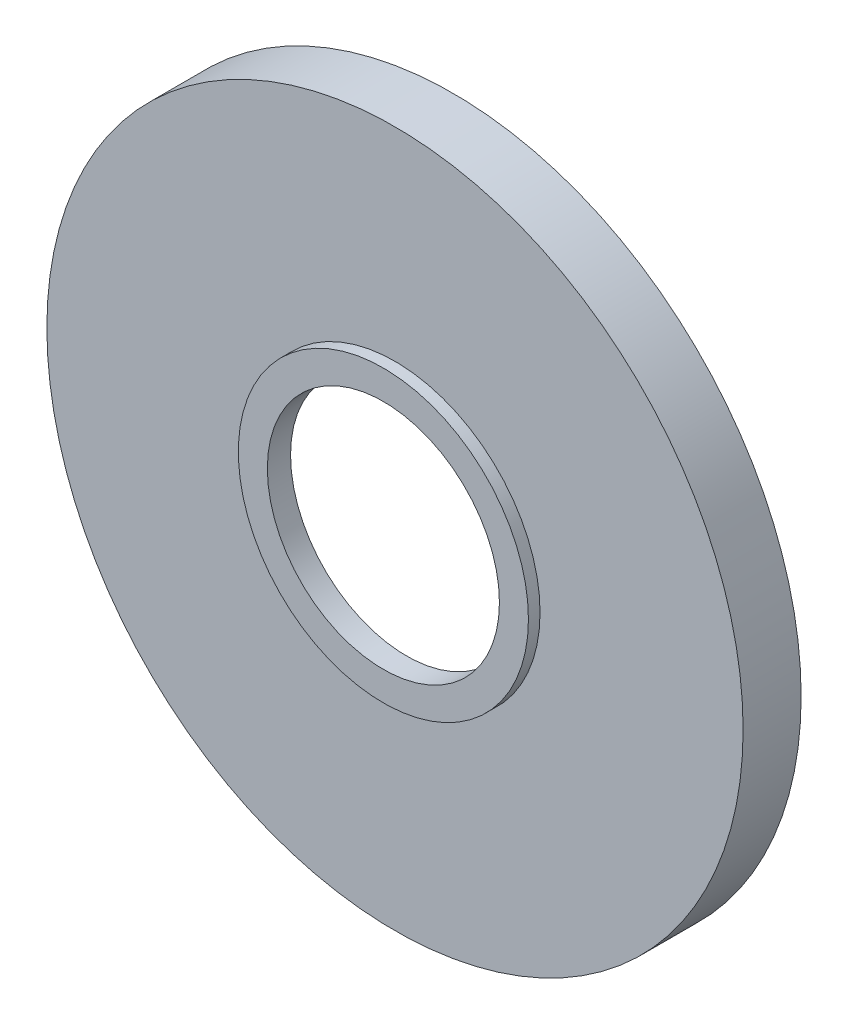
ISO-10303-21;
HEADER;
FILE_DESCRIPTION(('STEP AP214'),'2;1');
FILE_NAME('part.step','',(''),(''),'','','');
FILE_SCHEMA(('AUTOMOTIVE_DESIGN { 1 0 10303 214 1 1 1 1 }'));
ENDSEC;
DATA;
#1=APPLICATION_CONTEXT('core data for automotive mechanical design processes');
#2=APPLICATION_PROTOCOL_DEFINITION('international standard','automotive_design',2000,#1);
#3=PRODUCT_CONTEXT('',#1,'mechanical');
#4=PRODUCT('Part','Part','',(#3));
#5=PRODUCT_RELATED_PRODUCT_CATEGORY('part','',(#4));
#6=PRODUCT_DEFINITION_FORMATION('','',#4);
#7=PRODUCT_DEFINITION_CONTEXT('part definition',#1,'design');
#8=PRODUCT_DEFINITION('design','',#6,#7);
#9=PRODUCT_DEFINITION_SHAPE('','',#8);
#10=(LENGTH_UNIT() NAMED_UNIT(*) SI_UNIT(.MILLI.,.METRE.));
#11=(NAMED_UNIT(*) PLANE_ANGLE_UNIT() SI_UNIT($,.RADIAN.));
#12=(NAMED_UNIT(*) SI_UNIT($,.STERADIAN.) SOLID_ANGLE_UNIT());
#13=UNCERTAINTY_MEASURE_WITH_UNIT(LENGTH_MEASURE(1.E-05),#10,'distance_accuracy_value','');
#14=(GEOMETRIC_REPRESENTATION_CONTEXT(3) GLOBAL_UNCERTAINTY_ASSIGNED_CONTEXT((#13)) GLOBAL_UNIT_ASSIGNED_CONTEXT((#10,
#11,#12)) REPRESENTATION_CONTEXT('',''));
#15=CARTESIAN_POINT('',(0.,0.,0.));
#16=DIRECTION('',(0.,0.,1.));
#17=DIRECTION('',(1.,0.,0.));
#18=AXIS2_PLACEMENT_3D('',#15,#16,#17);
#19=CARTESIAN_POINT('',(0.,0.,10.));
#20=DIRECTION('',(0.,0.,1.));
#21=DIRECTION('',(1.,0.,0.));
#22=AXIS2_PLACEMENT_3D('',#19,#20,#21);
#23=PLANE('',#22);
#24=CARTESIAN_POINT('',(0.,0.,10.));
#25=DIRECTION('',(0.,0.,1.));
#26=DIRECTION('',(1.,0.,0.));
#27=AXIS2_PLACEMENT_3D('',#24,#25,#26);
#28=CIRCLE('',#27,60.);
#29=CARTESIAN_POINT('',(60.,0.,10.));
#30=VERTEX_POINT('',#29);
#31=EDGE_CURVE('E73',#30,#30,#28,.T.);
#32=ORIENTED_EDGE('',*,*,#31,.T.);
#33=EDGE_LOOP('',(#32));
#34=FACE_BOUND('',#33,.T.);
#35=CARTESIAN_POINT('',(0.,0.,10.));
#36=DIRECTION('',(0.,0.,1.));
#37=DIRECTION('',(1.,0.,0.));
#38=AXIS2_PLACEMENT_3D('',#35,#36,#37);
#39=CIRCLE('',#38,25.);
#40=CARTESIAN_POINT('',(25.,0.,10.));
#41=VERTEX_POINT('',#40);
#42=EDGE_CURVE('E82',#41,#41,#39,.T.);
#43=ORIENTED_EDGE('',*,*,#42,.F.);
#44=EDGE_LOOP('',(#43));
#45=FACE_BOUND('',#44,.T.);
#46=ADVANCED_FACE('F58',(#34,#45),#23,.T.);
#47=CARTESIAN_POINT('',(0.,0.,0.));
#48=DIRECTION('',(0.,0.,1.));
#49=DIRECTION('',(1.,0.,0.));
#50=AXIS2_PLACEMENT_3D('',#47,#48,#49);
#51=PLANE('',#50);
#52=CARTESIAN_POINT('',(0.,0.,0.));
#53=DIRECTION('',(0.,0.,1.));
#54=DIRECTION('',(1.,0.,0.));
#55=AXIS2_PLACEMENT_3D('',#52,#53,#54);
#56=CIRCLE('',#55,60.);
#57=CARTESIAN_POINT('',(60.,0.,0.));
#58=VERTEX_POINT('',#57);
#59=EDGE_CURVE('E11',#58,#58,#56,.T.);
#60=ORIENTED_EDGE('',*,*,#59,.F.);
#61=EDGE_LOOP('',(#60));
#62=FACE_BOUND('',#61,.T.);
#63=CARTESIAN_POINT('',(0.,0.,0.));
#64=DIRECTION('',(0.,0.,1.));
#65=DIRECTION('',(1.,0.,0.));
#66=AXIS2_PLACEMENT_3D('',#63,#64,#65);
#67=CIRCLE('',#66,57.);
#68=CARTESIAN_POINT('',(57.,0.,0.));
#69=VERTEX_POINT('',#68);
#70=EDGE_CURVE('E65',#69,#69,#67,.T.);
#71=ORIENTED_EDGE('',*,*,#70,.T.);
#72=EDGE_LOOP('',(#71));
#73=FACE_BOUND('',#72,.T.);
#74=ADVANCED_FACE('F108',(#62,#73),#51,.F.);
#75=CARTESIAN_POINT('',(0.,0.,8.));
#76=DIRECTION('',(0.,0.,-1.));
#77=DIRECTION('',(-1.,0.,0.));
#78=AXIS2_PLACEMENT_3D('',#75,#76,#77);
#79=CYLINDRICAL_SURFACE('',#78,60.);
#80=ORIENTED_EDGE('',*,*,#59,.T.);
#81=EDGE_LOOP('',(#80));
#82=FACE_BOUND('',#81,.T.);
#83=ORIENTED_EDGE('',*,*,#31,.F.);
#84=EDGE_LOOP('',(#83));
#85=FACE_BOUND('',#84,.T.);
#86=ADVANCED_FACE('F60',(#82,#85),#79,.T.);
#87=CARTESIAN_POINT('',(0.,0.,8.));
#88=DIRECTION('',(0.,0.,-1.));
#89=DIRECTION('',(-1.,0.,0.));
#90=AXIS2_PLACEMENT_3D('',#87,#88,#89);
#91=CYLINDRICAL_SURFACE('',#90,57.);
#92=CARTESIAN_POINT('',(0.,0.,8.));
#93=DIRECTION('',(0.,0.,1.));
#94=DIRECTION('',(1.,0.,0.));
#95=AXIS2_PLACEMENT_3D('',#92,#93,#94);
#96=CIRCLE('',#95,57.);
#97=CARTESIAN_POINT('',(57.,0.,8.));
#98=VERTEX_POINT('',#97);
#99=EDGE_CURVE('E69',#98,#98,#96,.T.);
#100=ORIENTED_EDGE('',*,*,#99,.T.);
#101=EDGE_LOOP('',(#100));
#102=FACE_BOUND('',#101,.T.);
#103=ORIENTED_EDGE('',*,*,#70,.F.);
#104=EDGE_LOOP('',(#103));
#105=FACE_BOUND('',#104,.T.);
#106=ADVANCED_FACE('F119',(#102,#105),#91,.F.);
#107=CARTESIAN_POINT('',(0.,0.,8.));
#108=DIRECTION('',(0.,0.,1.));
#109=DIRECTION('',(1.,0.,0.));
#110=AXIS2_PLACEMENT_3D('',#107,#108,#109);
#111=PLANE('',#110);
#112=CARTESIAN_POINT('',(0.,0.,8.));
#113=DIRECTION('',(0.,0.,1.));
#114=DIRECTION('',(1.,0.,0.));
#115=AXIS2_PLACEMENT_3D('',#112,#113,#114);
#116=CIRCLE('',#115,20.);
#117=CARTESIAN_POINT('',(20.,0.,8.));
#118=VERTEX_POINT('',#117);
#119=EDGE_CURVE('E78',#118,#118,#116,.T.);
#120=ORIENTED_EDGE('',*,*,#119,.T.);
#121=EDGE_LOOP('',(#120));
#122=FACE_BOUND('',#121,.T.);
#123=ORIENTED_EDGE('',*,*,#99,.F.);
#124=EDGE_LOOP('',(#123));
#125=FACE_BOUND('',#124,.T.);
#126=ADVANCED_FACE('F104',(#122,#125),#111,.F.);
#127=CARTESIAN_POINT('',(0.,0.,10.));
#128=DIRECTION('',(0.,0.,-1.));
#129=DIRECTION('',(-1.,0.,0.));
#130=AXIS2_PLACEMENT_3D('',#127,#128,#129);
#131=CYLINDRICAL_SURFACE('',#130,20.);
#132=ORIENTED_EDGE('',*,*,#119,.F.);
#133=EDGE_LOOP('',(#132));
#134=FACE_BOUND('',#133,.T.);
#135=CARTESIAN_POINT('',(0.,0.,12.));
#136=DIRECTION('',(0.,0.,1.));
#137=DIRECTION('',(1.,0.,0.));
#138=AXIS2_PLACEMENT_3D('',#135,#136,#137);
#139=CIRCLE('',#138,20.);
#140=CARTESIAN_POINT('',(20.,0.,12.));
#141=VERTEX_POINT('',#140);
#142=EDGE_CURVE('E85',#141,#141,#139,.T.);
#143=ORIENTED_EDGE('',*,*,#142,.T.);
#144=EDGE_LOOP('',(#143));
#145=FACE_BOUND('',#144,.T.);
#146=ADVANCED_FACE('F91',(#134,#145),#131,.F.);
#147=CARTESIAN_POINT('',(0.,0.,12.));
#148=DIRECTION('',(0.,0.,1.));
#149=DIRECTION('',(1.,0.,0.));
#150=AXIS2_PLACEMENT_3D('',#147,#148,#149);
#151=PLANE('',#150);
#152=CARTESIAN_POINT('',(0.,0.,12.));
#153=DIRECTION('',(0.,0.,1.));
#154=DIRECTION('',(1.,0.,0.));
#155=AXIS2_PLACEMENT_3D('',#152,#153,#154);
#156=CIRCLE('',#155,25.);
#157=CARTESIAN_POINT('',(25.,0.,12.));
#158=VERTEX_POINT('',#157);
#159=EDGE_CURVE('E81',#158,#158,#156,.T.);
#160=ORIENTED_EDGE('',*,*,#159,.T.);
#161=EDGE_LOOP('',(#160));
#162=FACE_BOUND('',#161,.T.);
#163=ORIENTED_EDGE('',*,*,#142,.F.);
#164=EDGE_LOOP('',(#163));
#165=FACE_BOUND('',#164,.T.);
#166=ADVANCED_FACE('F93',(#162,#165),#151,.T.);
#167=CARTESIAN_POINT('',(0.,0.,12.));
#168=DIRECTION('',(0.,0.,-1.));
#169=DIRECTION('',(-1.,0.,0.));
#170=AXIS2_PLACEMENT_3D('',#167,#168,#169);
#171=CYLINDRICAL_SURFACE('',#170,25.);
#172=ORIENTED_EDGE('',*,*,#159,.F.);
#173=EDGE_LOOP('',(#172));
#174=FACE_BOUND('',#173,.T.);
#175=ORIENTED_EDGE('',*,*,#42,.T.);
#176=EDGE_LOOP('',(#175));
#177=FACE_BOUND('',#176,.T.);
#178=ADVANCED_FACE('F95',(#174,#177),#171,.T.);
#179=CLOSED_SHELL('',(#46,#74,#86,#106,#126,#146,#166,#178));
#180=MANIFOLD_SOLID_BREP('B2',#179);
#181=ADVANCED_BREP_SHAPE_REPRESENTATION('',(#18,#180),#14);
#182=SHAPE_DEFINITION_REPRESENTATION(#9,#181);
ENDSEC;
END-ISO-10303-21;
